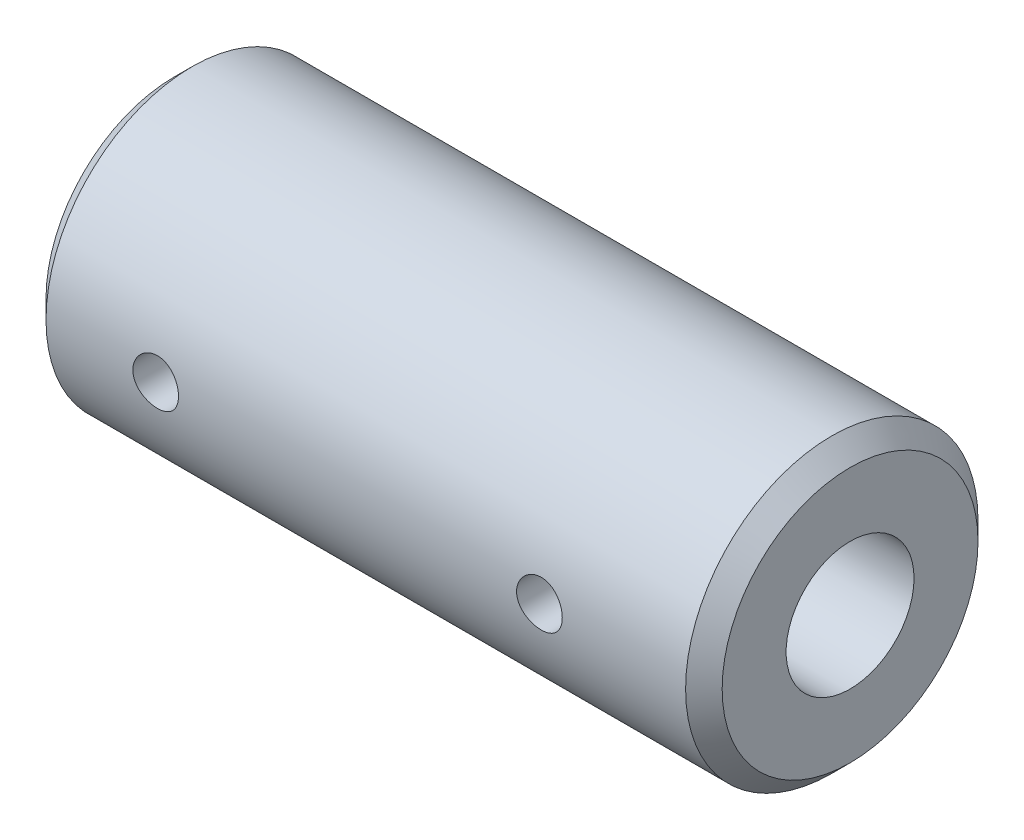
ISO-10303-21;
HEADER;
FILE_DESCRIPTION(('STEP AP214'),'2;1');
FILE_NAME('part.step','',(''),(''),'','','');
FILE_SCHEMA(('AUTOMOTIVE_DESIGN { 1 0 10303 214 1 1 1 1 }'));
ENDSEC;
DATA;
#1=APPLICATION_CONTEXT('core data for automotive mechanical design processes');
#2=APPLICATION_PROTOCOL_DEFINITION('international standard','automotive_design',2000,#1);
#3=PRODUCT_CONTEXT('',#1,'mechanical');
#4=PRODUCT('Part','Part','',(#3));
#5=PRODUCT_RELATED_PRODUCT_CATEGORY('part','',(#4));
#6=PRODUCT_DEFINITION_FORMATION('','',#4);
#7=PRODUCT_DEFINITION_CONTEXT('part definition',#1,'design');
#8=PRODUCT_DEFINITION('design','',#6,#7);
#9=PRODUCT_DEFINITION_SHAPE('','',#8);
#10=(LENGTH_UNIT() NAMED_UNIT(*) SI_UNIT(.MILLI.,.METRE.));
#11=(NAMED_UNIT(*) PLANE_ANGLE_UNIT() SI_UNIT($,.RADIAN.));
#12=(NAMED_UNIT(*) SI_UNIT($,.STERADIAN.) SOLID_ANGLE_UNIT());
#13=UNCERTAINTY_MEASURE_WITH_UNIT(LENGTH_MEASURE(1.E-05),#10,'distance_accuracy_value','');
#14=(GEOMETRIC_REPRESENTATION_CONTEXT(3) GLOBAL_UNCERTAINTY_ASSIGNED_CONTEXT((#13)) GLOBAL_UNIT_ASSIGNED_CONTEXT((#10,
#11,#12)) REPRESENTATION_CONTEXT('',''));
#15=CARTESIAN_POINT('',(0.,0.,0.));
#16=DIRECTION('',(0.,0.,1.));
#17=DIRECTION('',(1.,0.,0.));
#18=AXIS2_PLACEMENT_3D('',#15,#16,#17);
#19=CARTESIAN_POINT('',(-18.5,0.,0.));
#20=DIRECTION('',(1.,0.,0.));
#21=DIRECTION('',(0.,1.,0.));
#22=AXIS2_PLACEMENT_3D('',#19,#20,#21);
#23=PLANE('',#22);
#24=CARTESIAN_POINT('',(-18.5,0.,0.));
#25=DIRECTION('',(-1.,0.,0.));
#26=DIRECTION('',(0.,0.,1.));
#27=AXIS2_PLACEMENT_3D('',#24,#25,#26);
#28=CIRCLE('',#27,2.5);
#29=CARTESIAN_POINT('',(-18.5,0.,2.5));
#30=VERTEX_POINT('',#29);
#31=EDGE_CURVE('E73',#30,#30,#28,.T.);
#32=ORIENTED_EDGE('',*,*,#31,.F.);
#33=EDGE_LOOP('',(#32));
#34=FACE_BOUND('',#33,.T.);
#35=CARTESIAN_POINT('',(-18.5,0.,0.));
#36=DIRECTION('',(1.,0.,0.));
#37=DIRECTION('',(0.,1.,0.));
#38=AXIS2_PLACEMENT_3D('',#35,#36,#37);
#39=CIRCLE('',#38,6.99999999999999);
#40=CARTESIAN_POINT('',(-18.5,6.99999999999999,0.));
#41=VERTEX_POINT('',#40);
#42=EDGE_CURVE('E88',#41,#41,#39,.F.);
#43=ORIENTED_EDGE('',*,*,#42,.T.);
#44=EDGE_LOOP('',(#43));
#45=FACE_BOUND('',#44,.T.);
#46=ADVANCED_FACE('F45',(#34,#45),#23,.F.);
#47=CARTESIAN_POINT('',(-18.5,0.,0.));
#48=DIRECTION('',(-1.,0.,0.));
#49=DIRECTION('',(0.,-1.,0.));
#50=AXIS2_PLACEMENT_3D('',#47,#48,#49);
#51=CYLINDRICAL_SURFACE('',#50,8.);
#52=CARTESIAN_POINT('',(10.75,0.,8.));
#53=CARTESIAN_POINT('',(10.7499971508642,-0.0697575486355107,7.99999885097242));
#54=CARTESIAN_POINT('',(10.7441409431132,-0.139554702432846,7.9990780624287));
#55=CARTESIAN_POINT('',(10.7208781543616,-0.277195657489044,7.99549349048796));
#56=CARTESIAN_POINT('',(10.7034605537482,-0.345037530661651,7.99282804422361));
#57=CARTESIAN_POINT('',(10.6576101685967,-0.476756269023695,7.98605348582888));
#58=CARTESIAN_POINT('',(10.6291859593192,-0.540636176144944,7.98194549781586));
#59=CARTESIAN_POINT('',(10.5621507274292,-0.662710625522292,7.97273897019077));
#60=CARTESIAN_POINT('',(10.523541028482,-0.720905905184146,7.96764055931276));
#61=CARTESIAN_POINT('',(10.436883475823,-0.8304599558258,7.95697134207178));
#62=CARTESIAN_POINT('',(10.3887665025549,-0.881763739571313,7.95139725696168));
#63=CARTESIAN_POINT('',(10.2846090258656,-0.975603844114107,7.94043038065143));
#64=CARTESIAN_POINT('',(10.2285680513499,-1.01813964327095,7.93503760025374));
#65=CARTESIAN_POINT('',(10.1097808643281,-1.09345272164441,7.92501214063723));
#66=CARTESIAN_POINT('',(10.0470002588191,-1.12617636778995,7.92038369893052));
#67=CARTESIAN_POINT('',(9.9167492945711,-1.18059340798532,7.91245600871183));
#68=CARTESIAN_POINT('',(9.84927921374472,-1.20228745505031,7.90915668151108));
#69=CARTESIAN_POINT('',(9.71214454942811,-1.23385779661083,7.90429317255518));
#70=CARTESIAN_POINT('',(9.6425022070906,-1.24382852743747,7.90271513266182));
#71=CARTESIAN_POINT('',(9.50251640555368,-1.2519618487881,7.90143085535887));
#72=CARTESIAN_POINT('',(9.43217299026698,-1.25012517430232,7.90172450144012));
#73=CARTESIAN_POINT('',(9.29345148407366,-1.23477290404444,7.90413775227603));
#74=CARTESIAN_POINT('',(9.22506138832343,-1.22136281479846,7.90624086092473));
#75=CARTESIAN_POINT('',(9.09151399682034,-1.18340968916875,7.91201028172736));
#76=CARTESIAN_POINT('',(9.02635679967974,-1.15886631342065,7.91567664153206));
#77=CARTESIAN_POINT('',(8.90080564366143,-1.09923458474692,7.92417753427311));
#78=CARTESIAN_POINT('',(8.84043310411347,-1.06410186157774,7.92901696543622));
#79=CARTESIAN_POINT('',(8.72640023215724,-0.984320290733183,7.93931523075049));
#80=CARTESIAN_POINT('',(8.67274037755628,-0.93967076626508,7.94477410894106));
#81=CARTESIAN_POINT('',(8.57304487668335,-0.841545444111662,7.95576893124448));
#82=CARTESIAN_POINT('',(8.52709842086528,-0.787979002802694,7.96130506817796));
#83=CARTESIAN_POINT('',(8.44483342718006,-0.67384847368968,7.97177562673913));
#84=CARTESIAN_POINT('',(8.40851493822159,-0.61328435034066,7.97671004531012));
#85=CARTESIAN_POINT('',(8.34653096328881,-0.486797963528247,7.98542699513518));
#86=CARTESIAN_POINT('',(8.32087272073351,-0.420872093120232,7.98920874270967));
#87=CARTESIAN_POINT('',(8.28101701627639,-0.285574767348382,7.99518780000339));
#88=CARTESIAN_POINT('',(8.26681871296677,-0.216203565343603,7.99738522604488));
#89=CARTESIAN_POINT('',(8.25040536177491,-0.0767541683818714,7.99993255863639));
#90=CARTESIAN_POINT('',(8.24806776051191,-0.0066907307543551,8.0003013589643));
#91=CARTESIAN_POINT('',(8.25511635266799,0.132827273205816,7.99920143245635));
#92=CARTESIAN_POINT('',(8.26450215129456,0.202281859962573,7.99773276749822));
#93=CARTESIAN_POINT('',(8.29462919384009,0.338236723132846,7.99313461846611));
#94=CARTESIAN_POINT('',(8.31531037913387,0.404750631028015,7.99001392107693));
#95=CARTESIAN_POINT('',(8.3673775471994,0.533367033928306,7.98246037841779));
#96=CARTESIAN_POINT('',(8.39876406922134,0.595469306519696,7.97802746705036));
#97=CARTESIAN_POINT('',(8.47163599556329,0.714036101125196,7.96829486370472));
#98=CARTESIAN_POINT('',(8.51319871004524,0.770452561891855,7.9629886433171));
#99=CARTESIAN_POINT('',(8.60513604295389,0.875553482539022,7.95211940232218));
#100=CARTESIAN_POINT('',(8.65551121960243,0.92423745223508,7.94655636546338));
#101=CARTESIAN_POINT('',(8.76419059860861,1.01294040388344,7.93574013768325));
#102=CARTESIAN_POINT('',(8.82256242356116,1.05287699292062,7.93049020595402));
#103=CARTESIAN_POINT('',(8.94525803683066,1.12237783863319,7.92095346402914));
#104=CARTESIAN_POINT('',(9.00958165374473,1.15194239389052,7.91666662610999));
#105=CARTESIAN_POINT('',(9.14211482035709,1.19973385972496,7.90956535676178));
#106=CARTESIAN_POINT('',(9.21030873438281,1.21800327473955,7.9067454117448));
#107=CARTESIAN_POINT('',(9.34884457183198,1.24282061020267,7.90288285140397));
#108=CARTESIAN_POINT('',(9.4191863327095,1.24936941542498,7.9018401019222));
#109=CARTESIAN_POINT('',(9.55919935795373,1.25053726345377,7.90165529022442));
#110=CARTESIAN_POINT('',(9.62886954846674,1.24528590274212,7.90249258021451));
#111=CARTESIAN_POINT('',(9.76632264857214,1.2232811162795,7.90592849470915));
#112=CARTESIAN_POINT('',(9.83410556225085,1.2065277154348,7.90852711539976));
#113=CARTESIAN_POINT('',(9.96581891332025,1.16204164945925,7.91518544427453));
#114=CARTESIAN_POINT('',(10.0297527391292,1.1343188086929,7.91924384476704));
#115=CARTESIAN_POINT('',(10.1520828068381,1.06869384273208,7.92836592023698));
#116=CARTESIAN_POINT('',(10.2104788291442,1.03079131410442,7.93342963505413));
#117=CARTESIAN_POINT('',(10.3207327720634,0.945415040695395,7.9440578404613));
#118=CARTESIAN_POINT('',(10.3725160983069,0.897845535473839,7.94962700580145));
#119=CARTESIAN_POINT('',(10.4674106181934,0.794687973191018,7.96060021820367));
#120=CARTESIAN_POINT('',(10.5105197992959,0.739098060392161,7.96600422670061));
#121=CARTESIAN_POINT('',(10.5870756115158,0.621083429421707,7.9760755122835));
#122=CARTESIAN_POINT('',(10.6204626863798,0.558619686071191,7.98073817215134));
#123=CARTESIAN_POINT('',(10.6762204980965,0.428925941178893,7.9887562991944));
#124=CARTESIAN_POINT('',(10.6986024862792,0.361700888290883,7.9921131007106));
#125=CARTESIAN_POINT('',(10.7267165105453,0.245157119955799,7.9963872293244));
#126=CARTESIAN_POINT('',(10.7354342453145,0.196552787825815,7.99773495813061));
#127=CARTESIAN_POINT('',(10.7470769566895,0.098638898925295,7.99954174348811));
#128=CARTESIAN_POINT('',(10.7500020147787,0.049329352084564,8.00000081253982));
#129=CARTESIAN_POINT('',(10.75,0.,8.));
#130=B_SPLINE_CURVE_WITH_KNOTS('',3,(#52,#53,#54,#55,#56,#57,#58,#59,#60,#61,#62,#63,#64,#65,
#66,#67,#68,#69,#70,#71,#72,#73,#74,#75,#76,#77,#78,#79,#80,#81,#82,#83,#84,#85,#86,#87,#88,#89,
#90,#91,#92,#93,#94,#95,#96,#97,#98,#99,#100,#101,#102,#103,#104,#105,#106,#107,#108,#109,#110,
#111,#112,#113,#114,#115,#116,#117,#118,#119,#120,#121,#122,#123,#124,#125,#126,#127,#128,#129),
.UNSPECIFIED.,.T.,.F.,(4,2,2,2,2,2,2,2,2,2,2,2,2,2,2,2,2,2,2,2,2,2,2,2,2,2,2,2,2,2,2,2,2,2,2,2,
2,2,4),(0.,0.209092370238744,0.418384321264004,0.627513539720511,0.836615593960145,
1.04729784076099,1.2579926182271,1.46981889302879,1.68163262504618,1.89172815567496,
2.10181060835271,2.30999788011289,2.51819149825524,2.72726988701172,2.93636314946032,
3.14772866167181,3.35909524756911,3.5706052187728,3.78209965914931,3.99140427002955,
4.20070183264176,4.40889722378281,4.61710310371013,4.82694270734833,5.03679560800705,
5.24854740124792,5.46029309824487,5.67123705197562,5.88216508114644,6.09078790799342,
6.29941028309444,6.50784623483305,6.7162904483567,6.92691006157766,7.13757848571145,
7.34951152099917,7.56122742828135,7.70909008175765,7.85695065529349),.UNSPECIFIED.);
#131=CARTESIAN_POINT('',(10.75,0.,8.));
#132=VERTEX_POINT('',#131);
#133=EDGE_CURVE('E132',#132,#132,#130,.T.);
#134=ORIENTED_EDGE('',*,*,#133,.T.);
#135=EDGE_LOOP('',(#134));
#136=FACE_BOUND('',#135,.T.);
#137=CARTESIAN_POINT('',(-10.25,0.,8.));
#138=CARTESIAN_POINT('',(-10.2500028491358,-0.0697575486355144,7.99999885097242));
#139=CARTESIAN_POINT('',(-10.2558590568868,-0.13955470243285,7.9990780624287));
#140=CARTESIAN_POINT('',(-10.2791218456384,-0.277195657489048,7.99549349048796));
#141=CARTESIAN_POINT('',(-10.2965394462518,-0.345037530661655,7.99282804422361));
#142=CARTESIAN_POINT('',(-10.3423898314033,-0.476756269023697,7.98605348582888));
#143=CARTESIAN_POINT('',(-10.3708140406808,-0.540636176144946,7.98194549781586));
#144=CARTESIAN_POINT('',(-10.4378492725708,-0.662710625522294,7.97273897019077));
#145=CARTESIAN_POINT('',(-10.476458971518,-0.720905905184149,7.96764055931276));
#146=CARTESIAN_POINT('',(-10.563116524177,-0.830459955825803,7.95697134207178));
#147=CARTESIAN_POINT('',(-10.6112334974451,-0.881763739571316,7.95139725696168));
#148=CARTESIAN_POINT('',(-10.7153909741345,-0.975603844114109,7.94043038065143));
#149=CARTESIAN_POINT('',(-10.7714319486501,-1.01813964327095,7.93503760025374));
#150=CARTESIAN_POINT('',(-10.8902191356719,-1.09345272164441,7.92501214063723));
#151=CARTESIAN_POINT('',(-10.9529997411809,-1.12617636778995,7.92038369893052));
#152=CARTESIAN_POINT('',(-11.0832507054289,-1.18059340798532,7.91245600871183));
#153=CARTESIAN_POINT('',(-11.1507207862553,-1.20228745505031,7.90915668151108));
#154=CARTESIAN_POINT('',(-11.2878554505719,-1.23385779661083,7.90429317255518));
#155=CARTESIAN_POINT('',(-11.3574977929094,-1.24382852743747,7.90271513266182));
#156=CARTESIAN_POINT('',(-11.4974835944463,-1.2519618487881,7.90143085535887));
#157=CARTESIAN_POINT('',(-11.567827009733,-1.25012517430232,7.90172450144012));
#158=CARTESIAN_POINT('',(-11.7065485159263,-1.23477290404444,7.90413775227603));
#159=CARTESIAN_POINT('',(-11.7749386116766,-1.22136281479846,7.90624086092473));
#160=CARTESIAN_POINT('',(-11.9084860031797,-1.18340968916875,7.91201028172737));
#161=CARTESIAN_POINT('',(-11.9736432003203,-1.15886631342065,7.91567664153206));
#162=CARTESIAN_POINT('',(-12.0991943563386,-1.09923458474692,7.92417753427311));
#163=CARTESIAN_POINT('',(-12.1595668958865,-1.06410186157774,7.92901696543622));
#164=CARTESIAN_POINT('',(-12.2735997678428,-0.984320290733181,7.93931523075049));
#165=CARTESIAN_POINT('',(-12.3272596224437,-0.939670766265078,7.94477410894106));
#166=CARTESIAN_POINT('',(-12.4269551233167,-0.84154544411166,7.95576893124448));
#167=CARTESIAN_POINT('',(-12.4729015791347,-0.787979002802692,7.96130506817796));
#168=CARTESIAN_POINT('',(-12.5551665728199,-0.673848473689678,7.97177562673913));
#169=CARTESIAN_POINT('',(-12.5914850617784,-0.613284350340657,7.97671004531012));
#170=CARTESIAN_POINT('',(-12.6534690367112,-0.486797963528244,7.98542699513518));
#171=CARTESIAN_POINT('',(-12.6791272792665,-0.420872093120229,7.98920874270967));
#172=CARTESIAN_POINT('',(-12.7189829837236,-0.285574767348379,7.99518780000339));
#173=CARTESIAN_POINT('',(-12.7331812870332,-0.2162035653436,7.99738522604488));
#174=CARTESIAN_POINT('',(-12.7495946382251,-0.0767541683818682,7.99993255863639));
#175=CARTESIAN_POINT('',(-12.7519322394881,-0.00669073075435219,8.0003013589643));
#176=CARTESIAN_POINT('',(-12.744883647332,0.132827273205819,7.99920143245634));
#177=CARTESIAN_POINT('',(-12.7354978487054,0.202281859962575,7.99773276749821));
#178=CARTESIAN_POINT('',(-12.7053708061599,0.33823672313285,7.99313461846611));
#179=CARTESIAN_POINT('',(-12.6846896208661,0.404750631028018,7.99001392107693));
#180=CARTESIAN_POINT('',(-12.6326224528006,0.533367033928309,7.98246037841779));
#181=CARTESIAN_POINT('',(-12.6012359307787,0.595469306519699,7.97802746705036));
#182=CARTESIAN_POINT('',(-12.5283640044367,0.714036101125199,7.96829486370472));
#183=CARTESIAN_POINT('',(-12.4868012899548,0.770452561891857,7.9629886433171));
#184=CARTESIAN_POINT('',(-12.3948639570461,0.875553482539025,7.95211940232218));
#185=CARTESIAN_POINT('',(-12.3444887803976,0.924237452235083,7.94655636546338));
#186=CARTESIAN_POINT('',(-12.2358094013914,1.01294040388345,7.93574013768325));
#187=CARTESIAN_POINT('',(-12.1774375764388,1.05287699292062,7.93049020595401));
#188=CARTESIAN_POINT('',(-12.0547419631693,1.12237783863319,7.92095346402914));
#189=CARTESIAN_POINT('',(-11.9904183462553,1.15194239389052,7.91666662610999));
#190=CARTESIAN_POINT('',(-11.8578851796429,1.19973385972497,7.90956535676178));
#191=CARTESIAN_POINT('',(-11.7896912656172,1.21800327473955,7.9067454117448));
#192=CARTESIAN_POINT('',(-11.651155428168,1.24282061020267,7.90288285140397));
#193=CARTESIAN_POINT('',(-11.5808136672905,1.24936941542498,7.9018401019222));
#194=CARTESIAN_POINT('',(-11.4408006420463,1.25053726345377,7.90165529022442));
#195=CARTESIAN_POINT('',(-11.3711304515333,1.24528590274212,7.90249258021451));
#196=CARTESIAN_POINT('',(-11.2336773514279,1.2232811162795,7.90592849470915));
#197=CARTESIAN_POINT('',(-11.1658944377491,1.2065277154348,7.90852711539976));
#198=CARTESIAN_POINT('',(-11.0341810866797,1.16204164945925,7.91518544427453));
#199=CARTESIAN_POINT('',(-10.9702472608708,1.1343188086929,7.91924384476704));
#200=CARTESIAN_POINT('',(-10.8479171931619,1.06869384273208,7.92836592023698));
#201=CARTESIAN_POINT('',(-10.7895211708558,1.03079131410442,7.93342963505413));
#202=CARTESIAN_POINT('',(-10.6792672279366,0.945415040695392,7.9440578404613));
#203=CARTESIAN_POINT('',(-10.6274839016931,0.897845535473836,7.94962700580145));
#204=CARTESIAN_POINT('',(-10.5325893818066,0.794687973191016,7.96060021820367));
#205=CARTESIAN_POINT('',(-10.4894802007041,0.739098060392158,7.96600422670061));
#206=CARTESIAN_POINT('',(-10.4129243884842,0.621083429421704,7.9760755122835));
#207=CARTESIAN_POINT('',(-10.3795373136202,0.558619686071188,7.98073817215134));
#208=CARTESIAN_POINT('',(-10.3237795019035,0.42892594117889,7.9887562991944));
#209=CARTESIAN_POINT('',(-10.3013975137208,0.36170088829088,7.9921131007106));
#210=CARTESIAN_POINT('',(-10.2732834894547,0.245157119955797,7.9963872293244));
#211=CARTESIAN_POINT('',(-10.2645657546855,0.196552787825812,7.99773495813061));
#212=CARTESIAN_POINT('',(-10.2529230433105,0.0986388989252916,7.99954174348811));
#213=CARTESIAN_POINT('',(-10.2499979852213,0.0493293520845604,8.00000081253982));
#214=CARTESIAN_POINT('',(-10.25,0.,8.));
#215=B_SPLINE_CURVE_WITH_KNOTS('',3,(#137,#138,#139,#140,#141,#142,#143,#144,#145,#146,#147,
#148,#149,#150,#151,#152,#153,#154,#155,#156,#157,#158,#159,#160,#161,#162,#163,#164,#165,#166,
#167,#168,#169,#170,#171,#172,#173,#174,#175,#176,#177,#178,#179,#180,#181,#182,#183,#184,#185,
#186,#187,#188,#189,#190,#191,#192,#193,#194,#195,#196,#197,#198,#199,#200,#201,#202,#203,#204,
#205,#206,#207,#208,#209,#210,#211,#212,#213,#214),.UNSPECIFIED.,.T.,.F.,(4,2,2,2,2,2,2,2,2,2,2,
2,2,2,2,2,2,2,2,2,2,2,2,2,2,2,2,2,2,2,2,2,2,2,2,2,2,2,4),(0.,0.209092370238744,
0.418384321264005,0.62751353972051,0.836615593960145,1.04729784076099,1.2579926182271,
1.46981889302879,1.68163262504618,1.89172815567496,2.10181060835271,2.30999788011289,
2.51819149825524,2.72726988701172,2.93636314946032,3.14772866167181,3.35909524756911,
3.5706052187728,3.78209965914931,3.99140427002955,4.20070183264176,4.40889722378281,
4.61710310371013,4.82694270734833,5.03679560800705,5.24854740124793,5.46029309824487,
5.67123705197563,5.88216508114644,6.09078790799342,6.29941028309444,6.50784623483305,
6.7162904483567,6.92691006157766,7.13757848571145,7.34951152099917,7.56122742828135,
7.70909008175765,7.85695065529349),.UNSPECIFIED.);
#216=CARTESIAN_POINT('',(-10.25,0.,8.));
#217=VERTEX_POINT('',#216);
#218=EDGE_CURVE('E81',#217,#217,#215,.T.);
#219=ORIENTED_EDGE('',*,*,#218,.T.);
#220=EDGE_LOOP('',(#219));
#221=FACE_BOUND('',#220,.T.);
#222=CARTESIAN_POINT('',(-17.5,0.,0.));
#223=DIRECTION('',(1.,0.,0.));
#224=DIRECTION('',(0.,1.,0.));
#225=AXIS2_PLACEMENT_3D('',#222,#223,#224);
#226=CIRCLE('',#225,8.);
#227=CARTESIAN_POINT('',(-17.5,8.,0.));
#228=VERTEX_POINT('',#227);
#229=EDGE_CURVE('E55',#228,#228,#226,.T.);
#230=ORIENTED_EDGE('',*,*,#229,.T.);
#231=EDGE_LOOP('',(#230));
#232=FACE_BOUND('',#231,.T.);
#233=CARTESIAN_POINT('',(17.5,0.,0.));
#234=DIRECTION('',(-1.,0.,0.));
#235=DIRECTION('',(0.,-1.,0.));
#236=AXIS2_PLACEMENT_3D('',#233,#234,#235);
#237=CIRCLE('',#236,8.);
#238=CARTESIAN_POINT('',(17.5,-7.99999999999999,0.));
#239=VERTEX_POINT('',#238);
#240=EDGE_CURVE('E92',#239,#239,#237,.T.);
#241=ORIENTED_EDGE('',*,*,#240,.T.);
#242=EDGE_LOOP('',(#241));
#243=FACE_BOUND('',#242,.T.);
#244=ADVANCED_FACE('F99',(#136,#221,#232,#243),#51,.T.);
#245=CARTESIAN_POINT('',(18.5,8.00000000000001,0.));
#246=DIRECTION('',(-1.,0.,0.));
#247=DIRECTION('',(0.,-1.,0.));
#248=AXIS2_PLACEMENT_3D('',#245,#246,#247);
#249=PLANE('',#248);
#250=CARTESIAN_POINT('',(18.5,0.,0.));
#251=DIRECTION('',(1.,0.,0.));
#252=DIRECTION('',(0.,0.,-1.));
#253=AXIS2_PLACEMENT_3D('',#250,#251,#252);
#254=CIRCLE('',#253,3.49999999999999);
#255=CARTESIAN_POINT('',(18.5,0.,-3.49999999999999));
#256=VERTEX_POINT('',#255);
#257=EDGE_CURVE('E72',#256,#256,#254,.T.);
#258=ORIENTED_EDGE('',*,*,#257,.F.);
#259=EDGE_LOOP('',(#258));
#260=FACE_BOUND('',#259,.T.);
#261=CARTESIAN_POINT('',(18.5,0.,0.));
#262=DIRECTION('',(-1.,0.,0.));
#263=DIRECTION('',(0.,-1.,0.));
#264=AXIS2_PLACEMENT_3D('',#261,#262,#263);
#265=CIRCLE('',#264,6.99999999999999);
#266=CARTESIAN_POINT('',(18.5,-6.99999999999998,0.));
#267=VERTEX_POINT('',#266);
#268=EDGE_CURVE('E11',#267,#267,#265,.F.);
#269=ORIENTED_EDGE('',*,*,#268,.T.);
#270=EDGE_LOOP('',(#269));
#271=FACE_BOUND('',#270,.T.);
#272=ADVANCED_FACE('F105',(#260,#271),#249,.F.);
#273=CARTESIAN_POINT('',(-18.5,0.,0.));
#274=DIRECTION('',(1.,0.,0.));
#275=DIRECTION('',(0.,1.,0.));
#276=AXIS2_PLACEMENT_3D('',#273,#274,#275);
#277=CONICAL_SURFACE('',#276,6.99999999999999,0.785398163397449);
#278=ORIENTED_EDGE('',*,*,#229,.F.);
#279=EDGE_LOOP('',(#278));
#280=FACE_BOUND('',#279,.T.);
#281=ORIENTED_EDGE('',*,*,#42,.F.);
#282=EDGE_LOOP('',(#281));
#283=FACE_BOUND('',#282,.T.);
#284=ADVANCED_FACE('F102',(#280,#283),#277,.T.);
#285=CARTESIAN_POINT('',(17.5,0.,0.));
#286=DIRECTION('',(-1.,0.,0.));
#287=DIRECTION('',(0.,-1.,0.));
#288=AXIS2_PLACEMENT_3D('',#285,#286,#287);
#289=CONICAL_SURFACE('',#288,8.,0.785398163397449);
#290=ORIENTED_EDGE('',*,*,#268,.F.);
#291=EDGE_LOOP('',(#290));
#292=FACE_BOUND('',#291,.T.);
#293=ORIENTED_EDGE('',*,*,#240,.F.);
#294=EDGE_LOOP('',(#293));
#295=FACE_BOUND('',#294,.T.);
#296=ADVANCED_FACE('F48',(#292,#295),#289,.T.);
#297=CARTESIAN_POINT('',(3.60301216659646,0.,0.));
#298=DIRECTION('',(1.,0.,0.));
#299=DIRECTION('',(0.,0.,-1.));
#300=AXIS2_PLACEMENT_3D('',#297,#298,#299);
#301=CONICAL_SURFACE('',#300,3.5,1.02974425867665);
#302=CARTESIAN_POINT('',(1.5,0.,0.));
#303=VERTEX_POINT('',#302);
#304=VERTEX_LOOP('',#303);
#305=FACE_BOUND('',#304,.T.);
#306=CARTESIAN_POINT('',(3.60301216659646,0.,0.));
#307=DIRECTION('',(1.,0.,0.));
#308=DIRECTION('',(0.,0.,-1.));
#309=AXIS2_PLACEMENT_3D('',#306,#307,#308);
#310=CIRCLE('',#309,3.5);
#311=CARTESIAN_POINT('',(3.60301216659646,0.,-3.5));
#312=VERTEX_POINT('',#311);
#313=EDGE_CURVE('E78',#312,#312,#310,.T.);
#314=ORIENTED_EDGE('',*,*,#313,.T.);
#315=EDGE_LOOP('',(#314));
#316=FACE_BOUND('',#315,.T.);
#317=ADVANCED_FACE('F167',(#305,#316),#301,.F.);
#318=CARTESIAN_POINT('',(18.5,0.,0.));
#319=DIRECTION('',(1.,0.,0.));
#320=DIRECTION('',(0.,0.,-1.));
#321=AXIS2_PLACEMENT_3D('',#318,#319,#320);
#322=CYLINDRICAL_SURFACE('',#321,3.49999999999999);
#323=CARTESIAN_POINT('',(10.75,0.,3.49999999999999));
#324=CARTESIAN_POINT('',(10.7500014120209,0.067919880259367,3.50000101476474));
#325=CARTESIAN_POINT('',(10.7444466213836,0.135829714973765,3.49800528301824));
#326=CARTESIAN_POINT('',(10.722454356404,0.269632448303447,3.49024202474307));
#327=CARTESIAN_POINT('',(10.7060172974676,0.335525423807312,3.48447464218874));
#328=CARTESIAN_POINT('',(10.6629074293663,0.463346058337156,3.4697905490549));
#329=CARTESIAN_POINT('',(10.63625322014,0.525280685729592,3.46087956362172));
#330=CARTESIAN_POINT('',(10.5735556403162,0.643797926492003,3.44080539016176));
#331=CARTESIAN_POINT('',(10.5375100202755,0.70037925320037,3.42964166269989));
#332=CARTESIAN_POINT('',(10.4555784339418,0.808794014026728,3.40573688714876));
#333=CARTESIAN_POINT('',(10.4093906344973,0.860390078364251,3.39295413722536));
#334=CARTESIAN_POINT('',(10.3091268181051,0.955290996612145,3.36746761268132));
#335=CARTESIAN_POINT('',(10.2550487081418,0.998593643506724,3.35476385995096));
#336=CARTESIAN_POINT('',(10.1383011036122,1.0771186778092,3.33040035084485));
#337=CARTESIAN_POINT('',(10.0754026282418,1.11201764897414,3.31879053880897));
#338=CARTESIAN_POINT('',(9.94414816764782,1.17063786115001,3.29857176225753));
#339=CARTESIAN_POINT('',(9.87579414271614,1.19436309615772,3.28996172577382));
#340=CARTESIAN_POINT('',(9.73828858189876,1.22904565224263,3.27716019111028));
#341=CARTESIAN_POINT('',(9.66926534652844,1.24045259703665,3.27281366689501));
#342=CARTESIAN_POINT('',(9.5301581840881,1.25158076113739,3.26857530939902));
#343=CARTESIAN_POINT('',(9.46007465372922,1.25130624802986,3.26868184928064));
#344=CARTESIAN_POINT('',(9.32482217247376,1.23942539486164,3.27320294148597));
#345=CARTESIAN_POINT('',(9.25959082350013,1.22842580881823,3.27738681834519));
#346=CARTESIAN_POINT('',(9.13196923640833,1.19640425527529,3.28921041087191));
#347=CARTESIAN_POINT('',(9.06957938767461,1.17538091867306,3.29685059861533));
#348=CARTESIAN_POINT('',(8.94811312710715,1.12354783422049,3.31487585243906));
#349=CARTESIAN_POINT('',(8.88911519867074,1.09257097966627,3.3253072388752));
#350=CARTESIAN_POINT('',(8.77697180667515,1.02182636345347,3.34772234848184));
#351=CARTESIAN_POINT('',(8.7238282333463,0.982055774901157,3.35970657032335));
#352=CARTESIAN_POINT('',(8.62152020431444,0.892015745235532,3.38476249232946));
#353=CARTESIAN_POINT('',(8.57279107037543,0.841256657577185,3.39785611737175));
#354=CARTESIAN_POINT('',(8.48441415858261,0.732130922674567,3.42302736802757));
#355=CARTESIAN_POINT('',(8.44476752885063,0.673763315096845,3.43510486507013));
#356=CARTESIAN_POINT('',(8.3752596950304,0.550050171460873,3.45708499361));
#357=CARTESIAN_POINT('',(8.34553088005512,0.484624556212602,3.46695766085207));
#358=CARTESIAN_POINT('',(8.29764208791982,0.349261734063621,3.48319583843677));
#359=CARTESIAN_POINT('',(8.27947746961869,0.279326349526881,3.48956275562817));
#360=CARTESIAN_POINT('',(8.25604042467021,0.140602545906915,3.49783101316067));
#361=CARTESIAN_POINT('',(8.25018093462718,0.0719253065845451,3.49993551999546));
#362=CARTESIAN_POINT('',(8.2498274390049,-0.0654546857866971,3.50006148945357));
#363=CARTESIAN_POINT('',(8.25533118650412,-0.134157431106335,3.49808375928228));
#364=CARTESIAN_POINT('',(8.2770930686608,-0.267184349498884,3.49040174997619));
#365=CARTESIAN_POINT('',(8.29297737789908,-0.331577924040698,3.48482708909709));
#366=CARTESIAN_POINT('',(8.33456829736804,-0.456749722014995,3.47064122898338));
#367=CARTESIAN_POINT('',(8.36027618291429,-0.517527474850081,3.46202963549954));
#368=CARTESIAN_POINT('',(8.42157942670081,-0.635658954257502,3.44232869786663));
#369=CARTESIAN_POINT('',(8.45743324024969,-0.692867731493606,3.43117631231161));
#370=CARTESIAN_POINT('',(8.53771374755373,-0.800639684486848,3.40764197756899));
#371=CARTESIAN_POINT('',(8.58214338238693,-0.851200570319789,3.39525960726725));
#372=CARTESIAN_POINT('',(8.68106481636446,-0.947011460298758,3.36983020480226));
#373=CARTESIAN_POINT('',(8.73596235650984,-0.991843409534841,3.35678239933147));
#374=CARTESIAN_POINT('',(8.85277063500218,-1.07172762890799,3.33213937998854));
#375=CARTESIAN_POINT('',(8.91468171556431,-1.10677942154777,3.32054423705506));
#376=CARTESIAN_POINT('',(9.04403240461803,-1.16604343047105,3.30020166478303));
#377=CARTESIAN_POINT('',(9.11147783525494,-1.19024405378019,3.29145728379771));
#378=CARTESIAN_POINT('',(9.24988005036005,-1.22680709508373,3.2780072100212));
#379=CARTESIAN_POINT('',(9.32083491033116,-1.23917592731889,3.27329932910964));
#380=CARTESIAN_POINT('',(9.4597602396865,-1.2511812775343,3.26872798213916));
#381=CARTESIAN_POINT('',(9.52766160721221,-1.2515221348909,3.26859653378248));
#382=CARTESIAN_POINT('',(9.66249883532744,-1.24123517504434,3.27251659731885));
#383=CARTESIAN_POINT('',(9.72943477062407,-1.23060821122103,3.27656778377113));
#384=CARTESIAN_POINT('',(9.85875029268593,-1.19921503803596,3.28818350213892));
#385=CARTESIAN_POINT('',(9.92120204950289,-1.17870980504467,3.29565737124497));
#386=CARTESIAN_POINT('',(10.0418213409334,-1.12836322169085,3.31323164657559));
#387=CARTESIAN_POINT('',(10.0999878404721,-1.09851962478447,3.32333268472323));
#388=CARTESIAN_POINT('',(10.2134628749761,-1.02865156535952,3.34563615497416));
#389=CARTESIAN_POINT('',(10.2684940204315,-0.98820185797586,3.35791700168431));
#390=CARTESIAN_POINT('',(10.3712137523302,-0.898954315059612,3.38290205664158));
#391=CARTESIAN_POINT('',(10.4189001101755,-0.850153955167901,3.39560639196929));
#392=CARTESIAN_POINT('',(10.5078609514083,-0.742831261697616,3.42072722833852));
#393=CARTESIAN_POINT('',(10.5487265198954,-0.683958753083518,3.43310183535381));
#394=CARTESIAN_POINT('',(10.6199538319189,-0.559755656247316,3.45552462200922));
#395=CARTESIAN_POINT('',(10.6503163701013,-0.494425557079464,3.46557297763156));
#396=CARTESIAN_POINT('',(10.6995701551543,-0.358823168262489,3.48223003090416));
#397=CARTESIAN_POINT('',(10.7184127040813,-0.28853128023389,3.48882410986947));
#398=CARTESIAN_POINT('',(10.7436244373194,-0.145488440567409,3.49770771138795));
#399=CARTESIAN_POINT('',(10.7499984878032,-0.0727384595489127,3.49999891324271));
#400=CARTESIAN_POINT('',(10.75,0.,3.49999999999999));
#401=B_SPLINE_CURVE_WITH_KNOTS('',3,(#323,#324,#325,#326,#327,#328,#329,#330,#331,#332,#333,
#334,#335,#336,#337,#338,#339,#340,#341,#342,#343,#344,#345,#346,#347,#348,#349,#350,#351,#352,
#353,#354,#355,#356,#357,#358,#359,#360,#361,#362,#363,#364,#365,#366,#367,#368,#369,#370,#371,
#372,#373,#374,#375,#376,#377,#378,#379,#380,#381,#382,#383,#384,#385,#386,#387,#388,#389,#390,
#391,#392,#393,#394,#395,#396,#397,#398,#399,#400),.UNSPECIFIED.,.T.,.F.,(4,2,2,2,2,2,2,2,2,2,2,
2,2,2,2,2,2,2,2,2,2,2,2,2,2,2,2,2,2,2,2,2,2,2,2,2,2,2,4),(0.,0.203491608571476,
0.406975449759963,0.610090602128142,0.813254449702485,1.0235728622976,1.23394716657468,
1.45144803390166,1.66887109750174,1.87805781189361,2.08716810478224,2.28509623248972,
2.48305140213076,2.68452074834732,2.88605495467932,3.09978326567566,3.31353857923566,
3.53004262381811,3.74645972242784,3.95229264956038,4.1580848800041,4.35684663401411,
4.55563420042893,4.76002928476558,4.96449459134654,5.17969192319257,5.39489975979542,
5.61033697156533,5.82565732439204,6.02834654786541,6.23102000176531,6.42861041182003,
6.62624839308124,6.83351722626221,7.0408488267873,7.25796717892458,7.47506910056571,
7.69308253414563,7.91101086502749),.UNSPECIFIED.);
#402=CARTESIAN_POINT('',(10.75,0.,3.49999999999999));
#403=VERTEX_POINT('',#402);
#404=EDGE_CURVE('E141',#403,#403,#401,.T.);
#405=ORIENTED_EDGE('',*,*,#404,.T.);
#406=EDGE_LOOP('',(#405));
#407=FACE_BOUND('',#406,.T.);
#408=ORIENTED_EDGE('',*,*,#313,.F.);
#409=EDGE_LOOP('',(#408));
#410=FACE_BOUND('',#409,.T.);
#411=ORIENTED_EDGE('',*,*,#257,.T.);
#412=EDGE_LOOP('',(#411));
#413=FACE_BOUND('',#412,.T.);
#414=ADVANCED_FACE('F65',(#407,#410,#413),#322,.F.);
#415=CARTESIAN_POINT('',(-4.0021515475689,0.,0.));
#416=DIRECTION('',(-1.,0.,0.));
#417=DIRECTION('',(0.,0.,1.));
#418=AXIS2_PLACEMENT_3D('',#415,#416,#417);
#419=CONICAL_SURFACE('',#418,2.5,1.02974425867665);
#420=CARTESIAN_POINT('',(-2.5,0.,0.));
#421=VERTEX_POINT('',#420);
#422=VERTEX_LOOP('',#421);
#423=FACE_BOUND('',#422,.T.);
#424=CARTESIAN_POINT('',(-4.0021515475689,0.,0.));
#425=DIRECTION('',(-1.,0.,0.));
#426=DIRECTION('',(0.,0.,1.));
#427=AXIS2_PLACEMENT_3D('',#424,#425,#426);
#428=CIRCLE('',#427,2.5);
#429=CARTESIAN_POINT('',(-4.0021515475689,0.,2.5));
#430=VERTEX_POINT('',#429);
#431=EDGE_CURVE('E69',#430,#430,#428,.T.);
#432=ORIENTED_EDGE('',*,*,#431,.T.);
#433=EDGE_LOOP('',(#432));
#434=FACE_BOUND('',#433,.T.);
#435=ADVANCED_FACE('F61',(#423,#434),#419,.F.);
#436=CARTESIAN_POINT('',(-18.5,0.,0.));
#437=DIRECTION('',(-1.,0.,0.));
#438=DIRECTION('',(0.,0.,1.));
#439=AXIS2_PLACEMENT_3D('',#436,#437,#438);
#440=CYLINDRICAL_SURFACE('',#439,2.5);
#441=CARTESIAN_POINT('',(-10.25,0.,2.5));
#442=CARTESIAN_POINT('',(-10.2500041278994,0.0657149536912294,2.49999641755188));
#443=CARTESIAN_POINT('',(-10.2552125914021,0.131508249622537,2.49738113774397));
#444=CARTESIAN_POINT('',(-10.2758161004262,0.261150294085527,2.48717695046745));
#445=CARTESIAN_POINT('',(-10.2912304912471,0.324995108391874,2.47957859786229));
#446=CARTESIAN_POINT('',(-10.331492260771,0.448666931100712,2.46020349254139));
#447=CARTESIAN_POINT('',(-10.35630298031,0.508508503673968,2.448442989719));
#448=CARTESIAN_POINT('',(-10.4144632767062,0.623090771008199,2.42182220644723));
#449=CARTESIAN_POINT('',(-10.4478121803111,0.677831867487555,2.40696217041912));
#450=CARTESIAN_POINT('',(-10.5243965618566,0.784384772202391,2.37445322822571));
#451=CARTESIAN_POINT('',(-10.5681080990496,0.835819013902632,2.3566899890942));
#452=CARTESIAN_POINT('',(-10.6631518490588,0.930974306083714,2.3207496280843));
#453=CARTESIAN_POINT('',(-10.7144898147156,0.97468947888345,2.30257220261294));
#454=CARTESIAN_POINT('',(-10.8281041869042,1.05656500056284,2.26623688996684));
#455=CARTESIAN_POINT('',(-10.8909201229324,1.09403166943954,2.24818983712665));
#456=CARTESIAN_POINT('',(-11.0229591699828,1.15771028361336,2.21607473465401));
#457=CARTESIAN_POINT('',(-11.0921776609034,1.18393026870791,2.20200384508737));
#458=CARTESIAN_POINT('',(-11.2308313817774,1.22266555273573,2.18072333797261));
#459=CARTESIAN_POINT('',(-11.3000055650842,1.23590732135054,2.17315339479642));
#460=CARTESIAN_POINT('',(-11.4399735472243,1.25053374163605,2.1647736243566));
#461=CARTESIAN_POINT('',(-11.5107656760889,1.25193011046634,2.1639571167911));
#462=CARTESIAN_POINT('',(-11.6428575303942,1.24335910896536,2.1688866282156));
#463=CARTESIAN_POINT('',(-11.7042800390288,1.23473069942102,2.17385954577517));
#464=CARTESIAN_POINT('',(-11.8246523867163,1.20867481132116,2.18845285917313));
#465=CARTESIAN_POINT('',(-11.8836014316316,1.19124452987206,2.1980747353972));
#466=CARTESIAN_POINT('',(-11.9990364157071,1.1477622254825,2.22109345515926));
#467=CARTESIAN_POINT('',(-12.0554329984822,1.12151883389499,2.23457300829998));
#468=CARTESIAN_POINT('',(-12.1632928657375,1.061302109585,2.26379255351754));
#469=CARTESIAN_POINT('',(-12.2147539195001,1.02732530476558,2.27953355975238));
#470=CARTESIAN_POINT('',(-12.318151565929,0.947582568640983,2.31391447379107));
#471=CARTESIAN_POINT('',(-12.3693210919702,0.9008680729616,2.33266887795932));
#472=CARTESIAN_POINT('',(-12.4634192732386,0.799444473426715,2.36934529125509));
#473=CARTESIAN_POINT('',(-12.5063439900423,0.744731570717855,2.38726689948501));
#474=CARTESIAN_POINT('',(-12.5846070762872,0.62564563228981,2.42127484103704));
#475=CARTESIAN_POINT('',(-12.6195005905572,0.56094198949926,2.43723730202509));
#476=CARTESIAN_POINT('',(-12.6776212863038,0.425582769360997,2.46447351401552));
#477=CARTESIAN_POINT('',(-12.700857731269,0.354931970331597,2.4757509867944));
#478=CARTESIAN_POINT('',(-12.7330942546458,0.215958114575879,2.49155417176795));
#479=CARTESIAN_POINT('',(-12.7431140446835,0.147926913185408,2.49656172876639));
#480=CARTESIAN_POINT('',(-12.7518309139181,0.010974499936695,2.50091266823877));
#481=CARTESIAN_POINT('',(-12.7505333570493,-0.0579462748373734,2.5002587340164));
#482=CARTESIAN_POINT('',(-12.7372416394766,-0.189041214982488,2.49363990316801));
#483=CARTESIAN_POINT('',(-12.7260843340875,-0.251324260062439,2.48809057110237));
#484=CARTESIAN_POINT('',(-12.6947024101311,-0.373008615377392,2.47277714143523));
#485=CARTESIAN_POINT('',(-12.6744767919333,-0.432409607113741,2.46301257917915));
#486=CARTESIAN_POINT('',(-12.6250019169585,-0.548610760562076,2.43980314267087));
#487=CARTESIAN_POINT('',(-12.595511187354,-0.605287996257686,2.42626102212424));
#488=CARTESIAN_POINT('',(-12.5286155804424,-0.713076702123645,2.39679967896386));
#489=CARTESIAN_POINT('',(-12.4912073317582,-0.764185787219096,2.38087944457231));
#490=CARTESIAN_POINT('',(-12.4052994683339,-0.86470961161331,2.34635276671831));
#491=CARTESIAN_POINT('',(-12.356071414433,-0.913465097280792,2.32763606060552));
#492=CARTESIAN_POINT('',(-12.2500935609134,-1.00232040139154,2.29077989504843));
#493=CARTESIAN_POINT('',(-12.1933386014795,-1.04241423211354,2.27264084226908));
#494=CARTESIAN_POINT('',(-12.0704454322496,-1.11463489312211,2.23813990282585));
#495=CARTESIAN_POINT('',(-12.0039859172393,-1.14628186984829,2.2219066207934));
#496=CARTESIAN_POINT('',(-11.8656124153844,-1.19760353251725,2.19467590460158));
#497=CARTESIAN_POINT('',(-11.7937055918735,-1.21729364485945,2.18367172800773));
#498=CARTESIAN_POINT('',(-11.6538622214232,-1.24232710931209,2.16951876260834));
#499=CARTESIAN_POINT('',(-11.5862071832137,-1.24886624550107,2.16571729325614));
#500=CARTESIAN_POINT('',(-11.4506911660366,-1.25086144297598,2.16456693307719));
#501=CARTESIAN_POINT('',(-11.3828302890757,-1.24632230828049,2.16721524534441));
#502=CARTESIAN_POINT('',(-11.255645623085,-1.22740765699032,2.17797327562531));
#503=CARTESIAN_POINT('',(-11.1961244123195,-1.21401039292849,2.18553868102992));
#504=CARTESIAN_POINT('',(-11.0802398507191,-1.1789691977808,2.20463770234897));
#505=CARTESIAN_POINT('',(-11.0238775223851,-1.15732261394976,2.21617259462095));
#506=CARTESIAN_POINT('',(-10.9117189362668,-1.10476968162585,2.2428566295566));
#507=CARTESIAN_POINT('',(-10.8562151227129,-1.07333892227057,2.25819652995238));
#508=CARTESIAN_POINT('',(-10.7509068297743,-1.00268871454579,2.29044164543238));
#509=CARTESIAN_POINT('',(-10.7011053368519,-0.963465214048305,2.30734767243153));
#510=CARTESIAN_POINT('',(-10.602322522053,-0.872754158330797,2.34327903949141));
#511=CARTESIAN_POINT('',(-10.5541761220476,-0.82035552876271,2.36231229139336));
#512=CARTESIAN_POINT('',(-10.4671712707205,-0.707693507775347,2.39847190318859));
#513=CARTESIAN_POINT('',(-10.4283178257171,-0.647425904070979,2.4155972326005));
#514=CARTESIAN_POINT('',(-10.3609545465473,-0.519914496024932,2.44622511981379));
#515=CARTESIAN_POINT('',(-10.3325197882357,-0.452624379918266,2.45970120703636));
#516=CARTESIAN_POINT('',(-10.2877397901013,-0.313427626617738,2.48126676704332));
#517=CARTESIAN_POINT('',(-10.271360191463,-0.241534749528957,2.48937154216165));
#518=CARTESIAN_POINT('',(-10.2576282361552,-0.14075243310423,2.49619327387079));
#519=CARTESIAN_POINT('',(-10.2547716989205,-0.112702349299374,2.49761706674002));
#520=CARTESIAN_POINT('',(-10.250956668104,-0.0564396647589493,2.49952121222331));
#521=CARTESIAN_POINT('',(-10.249998226911,-0.0282270595592296,2.50000153879704));
#522=CARTESIAN_POINT('',(-10.25,0.,2.5));
#523=B_SPLINE_CURVE_WITH_KNOTS('',3,(#441,#442,#443,#444,#445,#446,#447,#448,#449,#450,#451,
#452,#453,#454,#455,#456,#457,#458,#459,#460,#461,#462,#463,#464,#465,#466,#467,#468,#469,#470,
#471,#472,#473,#474,#475,#476,#477,#478,#479,#480,#481,#482,#483,#484,#485,#486,#487,#488,#489,
#490,#491,#492,#493,#494,#495,#496,#497,#498,#499,#500,#501,#502,#503,#504,#505,#506,#507,#508,
#509,#510,#511,#512,#513,#514,#515,#516,#517,#518,#519,#520,#521,#522),.UNSPECIFIED.,.T.,.F.,(4,
2,2,2,2,2,2,2,2,2,2,2,2,2,2,2,2,2,2,2,2,2,2,2,2,2,2,2,2,2,2,2,2,2,2,2,2,2,2,2,4),(0.,
0.197030321775365,0.394435187136495,0.591077694365368,0.787704700726954,0.996227198397605,
1.20490779706754,1.4297715803844,1.6544743487285,1.86572515175286,2.07676696661274,
2.26257140511649,2.44843504907097,2.63862800210607,2.82890651575275,3.04331176667346,
3.25781918248356,3.48228777768049,3.70657771140347,3.9122911308918,4.11790705639343,
4.3075863313265,4.49728652038662,4.69241070034871,4.88761813435421,5.10199513305521,
5.31651985769287,5.54143352699589,5.76605639925969,5.96911634372963,6.17208824825003,
6.35572412805225,6.53941910979594,6.73545570969514,6.93159451423693,7.15156553440619,
7.37165479220711,7.59330017078652,7.81431135781158,7.89894100172117,7.98357298143554),.UNSPECIFIED.);
#524=CARTESIAN_POINT('',(-10.25,0.,2.5));
#525=VERTEX_POINT('',#524);
#526=EDGE_CURVE('E140',#525,#525,#523,.T.);
#527=ORIENTED_EDGE('',*,*,#526,.T.);
#528=EDGE_LOOP('',(#527));
#529=FACE_BOUND('',#528,.T.);
#530=ORIENTED_EDGE('',*,*,#431,.F.);
#531=EDGE_LOOP('',(#530));
#532=FACE_BOUND('',#531,.T.);
#533=ORIENTED_EDGE('',*,*,#31,.T.);
#534=EDGE_LOOP('',(#533));
#535=FACE_BOUND('',#534,.T.);
#536=ADVANCED_FACE('F64',(#529,#532,#535),#440,.F.);
#537=CARTESIAN_POINT('',(-11.5,0.,8.));
#538=DIRECTION('',(0.,0.,1.));
#539=DIRECTION('',(1.,0.,0.));
#540=AXIS2_PLACEMENT_3D('',#537,#538,#539);
#541=CYLINDRICAL_SURFACE('',#540,1.24999999999999);
#542=ORIENTED_EDGE('',*,*,#526,.F.);
#543=EDGE_LOOP('',(#542));
#544=FACE_BOUND('',#543,.T.);
#545=ORIENTED_EDGE('',*,*,#218,.F.);
#546=EDGE_LOOP('',(#545));
#547=FACE_BOUND('',#546,.T.);
#548=ADVANCED_FACE('F153',(#544,#547),#541,.F.);
#549=CARTESIAN_POINT('',(9.5,0.,8.));
#550=DIRECTION('',(0.,0.,1.));
#551=DIRECTION('',(1.,0.,0.));
#552=AXIS2_PLACEMENT_3D('',#549,#550,#551);
#553=CYLINDRICAL_SURFACE('',#552,1.24999999999999);
#554=ORIENTED_EDGE('',*,*,#404,.F.);
#555=EDGE_LOOP('',(#554));
#556=FACE_BOUND('',#555,.T.);
#557=ORIENTED_EDGE('',*,*,#133,.F.);
#558=EDGE_LOOP('',(#557));
#559=FACE_BOUND('',#558,.T.);
#560=ADVANCED_FACE('F150',(#556,#559),#553,.F.);
#561=CLOSED_SHELL('',(#46,#244,#272,#284,#296,#317,#414,#435,#536,#548,#560));
#562=MANIFOLD_SOLID_BREP('B2',#561);
#563=ADVANCED_BREP_SHAPE_REPRESENTATION('',(#18,#562),#14);
#564=SHAPE_DEFINITION_REPRESENTATION(#9,#563);
ENDSEC;
END-ISO-10303-21;
